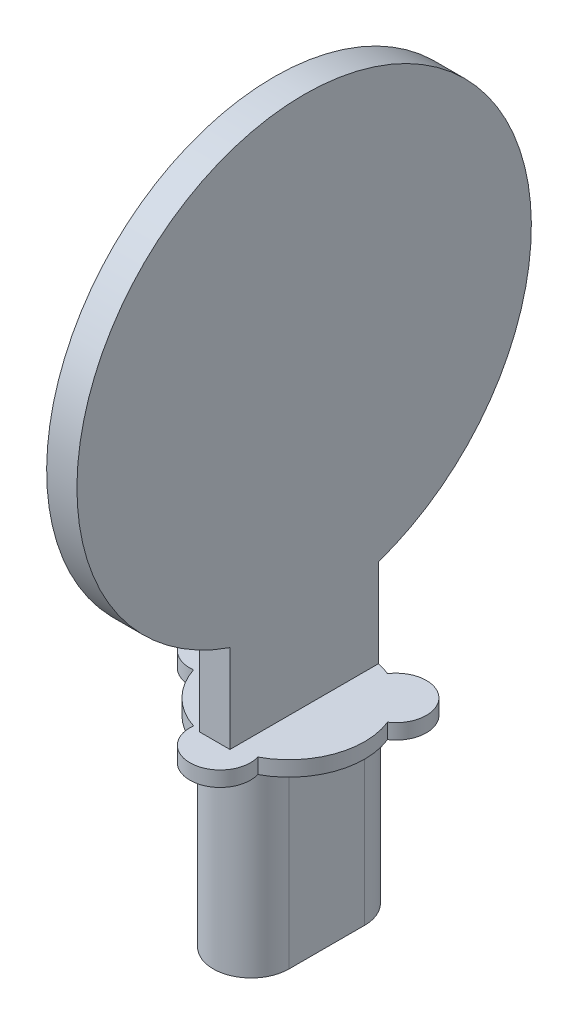
ISO-10303-21;
HEADER;
FILE_DESCRIPTION(('STEP AP214'),'2;1');
FILE_NAME('part.step','',(''),(''),'','','');
FILE_SCHEMA(('AUTOMOTIVE_DESIGN { 1 0 10303 214 1 1 1 1 }'));
ENDSEC;
DATA;
#1=APPLICATION_CONTEXT('core data for automotive mechanical design processes');
#2=APPLICATION_PROTOCOL_DEFINITION('international standard','automotive_design',2000,#1);
#3=PRODUCT_CONTEXT('',#1,'mechanical');
#4=PRODUCT('Part','Part','',(#3));
#5=PRODUCT_RELATED_PRODUCT_CATEGORY('part','',(#4));
#6=PRODUCT_DEFINITION_FORMATION('','',#4);
#7=PRODUCT_DEFINITION_CONTEXT('part definition',#1,'design');
#8=PRODUCT_DEFINITION('design','',#6,#7);
#9=PRODUCT_DEFINITION_SHAPE('','',#8);
#10=(LENGTH_UNIT() NAMED_UNIT(*) SI_UNIT(.MILLI.,.METRE.));
#11=(NAMED_UNIT(*) PLANE_ANGLE_UNIT() SI_UNIT($,.RADIAN.));
#12=(NAMED_UNIT(*) SI_UNIT($,.STERADIAN.) SOLID_ANGLE_UNIT());
#13=UNCERTAINTY_MEASURE_WITH_UNIT(LENGTH_MEASURE(1.E-05),#10,'distance_accuracy_value','');
#14=(GEOMETRIC_REPRESENTATION_CONTEXT(3) GLOBAL_UNCERTAINTY_ASSIGNED_CONTEXT((#13)) GLOBAL_UNIT_ASSIGNED_CONTEXT((#10,
#11,#12)) REPRESENTATION_CONTEXT('',''));
#15=CARTESIAN_POINT('',(0.,0.,0.));
#16=DIRECTION('',(0.,0.,1.));
#17=DIRECTION('',(1.,0.,0.));
#18=AXIS2_PLACEMENT_3D('',#15,#16,#17);
#19=CARTESIAN_POINT('',(0.,0.,-2.5));
#20=DIRECTION('',(0.,1.,0.));
#21=DIRECTION('',(0.,0.,1.));
#22=AXIS2_PLACEMENT_3D('',#19,#20,#21);
#23=PLANE('',#22);
#24=CARTESIAN_POINT('',(0.,0.,0.));
#25=DIRECTION('',(0.,1.,0.));
#26=DIRECTION('',(0.,0.,1.));
#27=AXIS2_PLACEMENT_3D('',#24,#25,#26);
#28=CIRCLE('',#27,5.);
#29=CARTESIAN_POINT('',(1.,0.,-4.89897948556636));
#30=VERTEX_POINT('',#29);
#31=CARTESIAN_POINT('',(-1.,0.,-4.89897948556636));
#32=VERTEX_POINT('',#31);
#33=EDGE_CURVE('E267',#30,#32,#28,.T.);
#34=ORIENTED_EDGE('',*,*,#33,.T.);
#35=DIRECTION('',(1.,0.,0.));
#36=VECTOR('',#35,1.);
#37=CARTESIAN_POINT('',(-0.999999999999999,0.,-4.89897948556636));
#38=LINE('',#37,#36);
#39=EDGE_CURVE('E197',#32,#30,#38,.T.);
#40=ORIENTED_EDGE('',*,*,#39,.T.);
#41=EDGE_LOOP('',(#34,#40));
#42=FACE_BOUND('',#41,.T.);
#43=ADVANCED_FACE('F68',(#42),#23,.T.);
#44=CARTESIAN_POINT('',(0.,-13.,-2.5));
#45=DIRECTION('',(0.,1.,0.));
#46=DIRECTION('',(0.,0.,1.));
#47=AXIS2_PLACEMENT_3D('',#44,#45,#46);
#48=CYLINDRICAL_SURFACE('',#47,2.5);
#49=CARTESIAN_POINT('',(0.,-0.999999999999999,-2.5));
#50=DIRECTION('',(0.,1.,0.));
#51=DIRECTION('',(0.,0.,1.));
#52=AXIS2_PLACEMENT_3D('',#49,#50,#51);
#53=CIRCLE('',#52,2.5);
#54=CARTESIAN_POINT('',(-2.5,-1.,-2.5));
#55=VERTEX_POINT('',#54);
#56=CARTESIAN_POINT('',(0.,-1.,-5.));
#57=VERTEX_POINT('',#56);
#58=EDGE_CURVE('E276',#55,#57,#53,.F.);
#59=ORIENTED_EDGE('',*,*,#58,.T.);
#60=CARTESIAN_POINT('',(2.5,-0.999999999999999,-2.5));
#61=VERTEX_POINT('',#60);
#62=EDGE_CURVE('E280',#57,#61,#53,.F.);
#63=ORIENTED_EDGE('',*,*,#62,.T.);
#64=DIRECTION('',(0.,1.,0.));
#65=VECTOR('',#64,1.);
#66=CARTESIAN_POINT('',(2.5,-13.,-2.5));
#67=LINE('',#66,#65);
#68=CARTESIAN_POINT('',(2.5,-13.,-2.5));
#69=VERTEX_POINT('',#68);
#70=EDGE_CURVE('E77',#69,#61,#67,.T.);
#71=ORIENTED_EDGE('',*,*,#70,.F.);
#72=CARTESIAN_POINT('',(0.,-13.,-2.5));
#73=DIRECTION('',(0.,1.,0.));
#74=DIRECTION('',(0.,0.,1.));
#75=AXIS2_PLACEMENT_3D('',#72,#73,#74);
#76=CIRCLE('',#75,2.5);
#77=CARTESIAN_POINT('',(-2.5,-13.,-2.5));
#78=VERTEX_POINT('',#77);
#79=EDGE_CURVE('E281',#69,#78,#76,.T.);
#80=ORIENTED_EDGE('',*,*,#79,.T.);
#81=DIRECTION('',(0.,1.,0.));
#82=VECTOR('',#81,1.);
#83=CARTESIAN_POINT('',(-2.5,-13.,-2.5));
#84=LINE('',#83,#82);
#85=EDGE_CURVE('E296',#78,#55,#84,.T.);
#86=ORIENTED_EDGE('',*,*,#85,.T.);
#87=EDGE_LOOP('',(#59,#63,#71,#80,#86));
#88=FACE_BOUND('',#87,.T.);
#89=ADVANCED_FACE('F70',(#88),#48,.T.);
#90=CARTESIAN_POINT('',(2.5,-13.,-2.5));
#91=DIRECTION('',(-1.,0.,0.));
#92=DIRECTION('',(0.,0.,1.));
#93=AXIS2_PLACEMENT_3D('',#90,#91,#92);
#94=PLANE('',#93);
#95=DIRECTION('',(0.,0.,-1.));
#96=VECTOR('',#95,1.);
#97=CARTESIAN_POINT('',(2.5,-0.999999999999999,-2.5));
#98=LINE('',#97,#96);
#99=CARTESIAN_POINT('',(2.50000000000001,-0.999999999999999,2.5));
#100=VERTEX_POINT('',#99);
#101=EDGE_CURVE('E273',#100,#61,#98,.T.);
#102=ORIENTED_EDGE('',*,*,#101,.F.);
#103=DIRECTION('',(0.,1.,0.));
#104=VECTOR('',#103,1.);
#105=CARTESIAN_POINT('',(2.50000000000001,-13.,2.5));
#106=LINE('',#105,#104);
#107=CARTESIAN_POINT('',(2.50000000000001,-13.,2.5));
#108=VERTEX_POINT('',#107);
#109=EDGE_CURVE('E300',#108,#100,#106,.T.);
#110=ORIENTED_EDGE('',*,*,#109,.F.);
#111=DIRECTION('',(0.,0.,1.));
#112=VECTOR('',#111,1.);
#113=CARTESIAN_POINT('',(2.5,-13.,-2.5));
#114=LINE('',#113,#112);
#115=EDGE_CURVE('E293',#69,#108,#114,.T.);
#116=ORIENTED_EDGE('',*,*,#115,.F.);
#117=ORIENTED_EDGE('',*,*,#70,.T.);
#118=EDGE_LOOP('',(#102,#110,#116,#117));
#119=FACE_BOUND('',#118,.T.);
#120=ADVANCED_FACE('F326',(#119),#94,.F.);
#121=CARTESIAN_POINT('',(0.,-13.,2.5));
#122=DIRECTION('',(0.,1.,0.));
#123=DIRECTION('',(0.,0.,1.));
#124=AXIS2_PLACEMENT_3D('',#121,#122,#123);
#125=CYLINDRICAL_SURFACE('',#124,2.5);
#126=ORIENTED_EDGE('',*,*,#109,.T.);
#127=CARTESIAN_POINT('',(0.,-0.999999999999999,2.5));
#128=DIRECTION('',(0.,1.,0.));
#129=DIRECTION('',(0.,0.,1.));
#130=AXIS2_PLACEMENT_3D('',#127,#128,#129);
#131=CIRCLE('',#130,2.5);
#132=CARTESIAN_POINT('',(-2.5,-0.999999999999999,2.5));
#133=VERTEX_POINT('',#132);
#134=EDGE_CURVE('E224',#100,#133,#131,.F.);
#135=ORIENTED_EDGE('',*,*,#134,.T.);
#136=DIRECTION('',(0.,1.,0.));
#137=VECTOR('',#136,1.);
#138=CARTESIAN_POINT('',(-2.5,-13.,2.5));
#139=LINE('',#138,#137);
#140=CARTESIAN_POINT('',(-2.5,-13.,2.5));
#141=VERTEX_POINT('',#140);
#142=EDGE_CURVE('E304',#141,#133,#139,.T.);
#143=ORIENTED_EDGE('',*,*,#142,.F.);
#144=CARTESIAN_POINT('',(0.,-13.,2.5));
#145=DIRECTION('',(0.,1.,0.));
#146=DIRECTION('',(0.,0.,1.));
#147=AXIS2_PLACEMENT_3D('',#144,#145,#146);
#148=CIRCLE('',#147,2.5);
#149=EDGE_CURVE('E289',#141,#108,#148,.T.);
#150=ORIENTED_EDGE('',*,*,#149,.T.);
#151=EDGE_LOOP('',(#126,#135,#143,#150));
#152=FACE_BOUND('',#151,.T.);
#153=ADVANCED_FACE('F321',(#152),#125,.T.);
#154=CARTESIAN_POINT('',(-2.5,-13.,-2.5));
#155=DIRECTION('',(-1.,0.,0.));
#156=DIRECTION('',(0.,0.,1.));
#157=AXIS2_PLACEMENT_3D('',#154,#155,#156);
#158=PLANE('',#157);
#159=ORIENTED_EDGE('',*,*,#142,.T.);
#160=DIRECTION('',(0.,0.,-1.));
#161=VECTOR('',#160,1.);
#162=CARTESIAN_POINT('',(-2.5,-0.999999999999999,-2.5));
#163=LINE('',#162,#161);
#164=EDGE_CURVE('E12',#133,#55,#163,.T.);
#165=ORIENTED_EDGE('',*,*,#164,.T.);
#166=ORIENTED_EDGE('',*,*,#85,.F.);
#167=DIRECTION('',(0.,0.,1.));
#168=VECTOR('',#167,1.);
#169=CARTESIAN_POINT('',(-2.5,-13.,-2.5));
#170=LINE('',#169,#168);
#171=EDGE_CURVE('E285',#78,#141,#170,.T.);
#172=ORIENTED_EDGE('',*,*,#171,.T.);
#173=EDGE_LOOP('',(#159,#165,#166,#172));
#174=FACE_BOUND('',#173,.T.);
#175=ADVANCED_FACE('F314',(#174),#158,.T.);
#176=CARTESIAN_POINT('',(0.,-13.,-2.5));
#177=DIRECTION('',(0.,1.,0.));
#178=DIRECTION('',(0.,0.,1.));
#179=AXIS2_PLACEMENT_3D('',#176,#177,#178);
#180=PLANE('',#179);
#181=ORIENTED_EDGE('',*,*,#79,.F.);
#182=ORIENTED_EDGE('',*,*,#115,.T.);
#183=ORIENTED_EDGE('',*,*,#149,.F.);
#184=ORIENTED_EDGE('',*,*,#171,.F.);
#185=EDGE_LOOP('',(#181,#182,#183,#184));
#186=FACE_BOUND('',#185,.T.);
#187=ADVANCED_FACE('F317',(#186),#180,.F.);
#188=CARTESIAN_POINT('',(0.,-1.,0.));
#189=DIRECTION('',(0.,1.,0.));
#190=DIRECTION('',(0.,0.,1.));
#191=AXIS2_PLACEMENT_3D('',#188,#189,#190);
#192=CYLINDRICAL_SURFACE('',#191,5.);
#193=DIRECTION('',(0.,1.,0.));
#194=VECTOR('',#193,1.);
#195=CARTESIAN_POINT('',(-4.41170593291399,-1.,-2.35305137247182));
#196=LINE('',#195,#194);
#197=CARTESIAN_POINT('',(-4.41170593291399,-1.,-2.35305137247182));
#198=VERTEX_POINT('',#197);
#199=CARTESIAN_POINT('',(-4.41170593291399,0.,-2.35305137247182));
#200=VERTEX_POINT('',#199);
#201=EDGE_CURVE('E231',#198,#200,#196,.T.);
#202=ORIENTED_EDGE('',*,*,#201,.T.);
#203=EDGE_CURVE('E268',#32,#200,#28,.T.);
#204=ORIENTED_EDGE('',*,*,#203,.F.);
#205=ORIENTED_EDGE('',*,*,#33,.F.);
#206=CARTESIAN_POINT('',(1.86705054740302,0.,-4.63833183951322));
#207=VERTEX_POINT('',#206);
#208=EDGE_CURVE('E262',#207,#30,#28,.T.);
#209=ORIENTED_EDGE('',*,*,#208,.F.);
#210=DIRECTION('',(0.,1.,0.));
#211=VECTOR('',#210,1.);
#212=CARTESIAN_POINT('',(1.86705054740302,-1.,-4.63833183951322));
#213=LINE('',#212,#211);
#214=CARTESIAN_POINT('',(1.86705054740302,-1.,-4.63833183951322));
#215=VERTEX_POINT('',#214);
#216=EDGE_CURVE('E236',#215,#207,#213,.T.);
#217=ORIENTED_EDGE('',*,*,#216,.F.);
#218=CARTESIAN_POINT('',(0.,-1.,0.));
#219=DIRECTION('',(0.,1.,0.));
#220=DIRECTION('',(0.,0.,1.));
#221=AXIS2_PLACEMENT_3D('',#218,#219,#220);
#222=CIRCLE('',#221,5.);
#223=EDGE_CURVE('E251',#215,#57,#222,.T.);
#224=ORIENTED_EDGE('',*,*,#223,.T.);
#225=EDGE_CURVE('E260',#57,#198,#222,.T.);
#226=ORIENTED_EDGE('',*,*,#225,.T.);
#227=EDGE_LOOP('',(#202,#204,#205,#209,#217,#224,#226));
#228=FACE_BOUND('',#227,.T.);
#229=ADVANCED_FACE('F355',(#228),#192,.T.);
#230=CARTESIAN_POINT('',(0.435778713738293,-1.,4.98097349045873));
#231=DIRECTION('',(0.,1.,0.));
#232=DIRECTION('',(0.,0.,1.));
#233=AXIS2_PLACEMENT_3D('',#230,#231,#232);
#234=CYLINDRICAL_SURFACE('',#233,2.);
#235=CARTESIAN_POINT('',(0.435778713738293,0.,4.98097349045873));
#236=DIRECTION('',(0.,1.,0.));
#237=DIRECTION('',(0.,0.,1.));
#238=AXIS2_PLACEMENT_3D('',#235,#236,#237);
#239=CIRCLE('',#238,2.);
#240=CARTESIAN_POINT('',(-1.55121853919334,0.,4.75328528953006));
#241=VERTEX_POINT('',#240);
#242=CARTESIAN_POINT('',(2.3530513724718,0.,4.411705932914));
#243=VERTEX_POINT('',#242);
#244=EDGE_CURVE('E216',#241,#243,#239,.T.);
#245=ORIENTED_EDGE('',*,*,#244,.F.);
#246=DIRECTION('',(0.,1.,0.));
#247=VECTOR('',#246,1.);
#248=CARTESIAN_POINT('',(-1.55121853919334,-1.,4.75328528953006));
#249=LINE('',#248,#247);
#250=CARTESIAN_POINT('',(-1.55121853919334,-1.,4.75328528953006));
#251=VERTEX_POINT('',#250);
#252=EDGE_CURVE('E215',#251,#241,#249,.T.);
#253=ORIENTED_EDGE('',*,*,#252,.F.);
#254=CARTESIAN_POINT('',(0.435778713738293,-1.,4.98097349045873));
#255=DIRECTION('',(0.,1.,0.));
#256=DIRECTION('',(0.,0.,1.));
#257=AXIS2_PLACEMENT_3D('',#254,#255,#256);
#258=CIRCLE('',#257,2.);
#259=CARTESIAN_POINT('',(2.3530513724718,-1.,4.411705932914));
#260=VERTEX_POINT('',#259);
#261=EDGE_CURVE('E211',#251,#260,#258,.T.);
#262=ORIENTED_EDGE('',*,*,#261,.T.);
#263=DIRECTION('',(0.,1.,0.));
#264=VECTOR('',#263,1.);
#265=CARTESIAN_POINT('',(2.3530513724718,-1.,4.411705932914));
#266=LINE('',#265,#264);
#267=EDGE_CURVE('E221',#260,#243,#266,.T.);
#268=ORIENTED_EDGE('',*,*,#267,.T.);
#269=EDGE_LOOP('',(#245,#253,#262,#268));
#270=FACE_BOUND('',#269,.T.);
#271=ADVANCED_FACE('F391',(#270),#234,.T.);
#272=CARTESIAN_POINT('',(0.,-1.,0.));
#273=DIRECTION('',(0.,1.,0.));
#274=DIRECTION('',(0.,0.,1.));
#275=AXIS2_PLACEMENT_3D('',#272,#273,#274);
#276=PLANE('',#275);
#277=ORIENTED_EDGE('',*,*,#62,.F.);
#278=ORIENTED_EDGE('',*,*,#223,.F.);
#279=CARTESIAN_POINT('',(3.53553390593274,-1.,-3.53553390593274));
#280=DIRECTION('',(0.,1.,0.));
#281=DIRECTION('',(0.,0.,1.));
#282=AXIS2_PLACEMENT_3D('',#279,#280,#281);
#283=CIRCLE('',#282,2.);
#284=CARTESIAN_POINT('',(4.63833183951322,-1.,-1.86705054740301));
#285=VERTEX_POINT('',#284);
#286=EDGE_CURVE('E242',#285,#215,#283,.T.);
#287=ORIENTED_EDGE('',*,*,#286,.F.);
#288=EDGE_CURVE('E266',#260,#285,#222,.T.);
#289=ORIENTED_EDGE('',*,*,#288,.F.);
#290=ORIENTED_EDGE('',*,*,#261,.F.);
#291=CARTESIAN_POINT('',(-4.75328528953006,-1.,1.55121853919333));
#292=VERTEX_POINT('',#291);
#293=EDGE_CURVE('E261',#292,#251,#222,.T.);
#294=ORIENTED_EDGE('',*,*,#293,.F.);
#295=CARTESIAN_POINT('',(-4.98097349045873,-1.,-0.435778713738309));
#296=DIRECTION('',(0.,1.,0.));
#297=DIRECTION('',(0.,0.,1.));
#298=AXIS2_PLACEMENT_3D('',#295,#296,#297);
#299=CIRCLE('',#298,2.);
#300=EDGE_CURVE('E227',#198,#292,#299,.T.);
#301=ORIENTED_EDGE('',*,*,#300,.F.);
#302=ORIENTED_EDGE('',*,*,#225,.F.);
#303=ORIENTED_EDGE('',*,*,#58,.F.);
#304=ORIENTED_EDGE('',*,*,#164,.F.);
#305=ORIENTED_EDGE('',*,*,#134,.F.);
#306=ORIENTED_EDGE('',*,*,#101,.T.);
#307=EDGE_LOOP('',(#277,#278,#287,#289,#290,#294,#301,#302,#303,#304,#305,#306));
#308=FACE_BOUND('',#307,.T.);
#309=ADVANCED_FACE('F324',(#308),#276,.F.);
#310=CARTESIAN_POINT('',(-4.98097349045873,-1.,-0.435778713738309));
#311=DIRECTION('',(0.,1.,0.));
#312=DIRECTION('',(0.,0.,1.));
#313=AXIS2_PLACEMENT_3D('',#310,#311,#312);
#314=CYLINDRICAL_SURFACE('',#313,2.);
#315=CARTESIAN_POINT('',(-4.98097349045873,0.,-0.435778713738309));
#316=DIRECTION('',(0.,1.,0.));
#317=DIRECTION('',(0.,0.,1.));
#318=AXIS2_PLACEMENT_3D('',#315,#316,#317);
#319=CIRCLE('',#318,2.);
#320=CARTESIAN_POINT('',(-4.75328528953006,0.,1.55121853919333));
#321=VERTEX_POINT('',#320);
#322=EDGE_CURVE('E232',#200,#321,#319,.T.);
#323=ORIENTED_EDGE('',*,*,#322,.F.);
#324=ORIENTED_EDGE('',*,*,#201,.F.);
#325=ORIENTED_EDGE('',*,*,#300,.T.);
#326=DIRECTION('',(0.,1.,0.));
#327=VECTOR('',#326,1.);
#328=CARTESIAN_POINT('',(-4.75328528953006,-1.,1.55121853919333));
#329=LINE('',#328,#327);
#330=EDGE_CURVE('E220',#292,#321,#329,.T.);
#331=ORIENTED_EDGE('',*,*,#330,.T.);
#332=EDGE_LOOP('',(#323,#324,#325,#331));
#333=FACE_BOUND('',#332,.T.);
#334=ADVANCED_FACE('F390',(#333),#314,.T.);
#335=CARTESIAN_POINT('',(3.53553390593274,-1.,-3.53553390593274));
#336=DIRECTION('',(0.,1.,0.));
#337=DIRECTION('',(0.,0.,1.));
#338=AXIS2_PLACEMENT_3D('',#335,#336,#337);
#339=CYLINDRICAL_SURFACE('',#338,2.);
#340=CARTESIAN_POINT('',(3.53553390593274,0.,-3.53553390593274));
#341=DIRECTION('',(0.,1.,0.));
#342=DIRECTION('',(0.,0.,1.));
#343=AXIS2_PLACEMENT_3D('',#340,#341,#342);
#344=CIRCLE('',#343,2.);
#345=CARTESIAN_POINT('',(4.63833183951322,0.,-1.86705054740301));
#346=VERTEX_POINT('',#345);
#347=EDGE_CURVE('E247',#346,#207,#344,.T.);
#348=ORIENTED_EDGE('',*,*,#347,.F.);
#349=DIRECTION('',(0.,1.,0.));
#350=VECTOR('',#349,1.);
#351=CARTESIAN_POINT('',(4.63833183951322,-1.,-1.86705054740301));
#352=LINE('',#351,#350);
#353=EDGE_CURVE('E246',#285,#346,#352,.T.);
#354=ORIENTED_EDGE('',*,*,#353,.F.);
#355=ORIENTED_EDGE('',*,*,#286,.T.);
#356=ORIENTED_EDGE('',*,*,#216,.T.);
#357=EDGE_LOOP('',(#348,#354,#355,#356));
#358=FACE_BOUND('',#357,.T.);
#359=ADVANCED_FACE('F351',(#358),#339,.T.);
#360=EDGE_CURVE('E210',#243,#346,#28,.T.);
#361=ORIENTED_EDGE('',*,*,#360,.F.);
#362=ORIENTED_EDGE('',*,*,#267,.F.);
#363=ORIENTED_EDGE('',*,*,#288,.T.);
#364=ORIENTED_EDGE('',*,*,#353,.T.);
#365=EDGE_LOOP('',(#361,#362,#363,#364));
#366=FACE_BOUND('',#365,.T.);
#367=ADVANCED_FACE('F347',(#366),#192,.T.);
#368=ORIENTED_EDGE('',*,*,#293,.T.);
#369=ORIENTED_EDGE('',*,*,#252,.T.);
#370=EDGE_CURVE('E269',#321,#241,#28,.T.);
#371=ORIENTED_EDGE('',*,*,#370,.F.);
#372=ORIENTED_EDGE('',*,*,#330,.F.);
#373=EDGE_LOOP('',(#368,#369,#371,#372));
#374=FACE_BOUND('',#373,.T.);
#375=ADVANCED_FACE('F380',(#374),#192,.T.);
#376=DIRECTION('',(1.,0.,0.));
#377=VECTOR('',#376,1.);
#378=CARTESIAN_POINT('',(-0.999999999999999,0.,4.89897948556636));
#379=LINE('',#378,#377);
#380=CARTESIAN_POINT('',(-0.999999999999999,0.,4.89897948556636));
#381=VERTEX_POINT('',#380);
#382=CARTESIAN_POINT('',(1.,0.,4.89897948556636));
#383=VERTEX_POINT('',#382);
#384=EDGE_CURVE('E358',#381,#383,#379,.T.);
#385=ORIENTED_EDGE('',*,*,#384,.F.);
#386=DIRECTION('',(0.,0.,-1.));
#387=VECTOR('',#386,1.);
#388=CARTESIAN_POINT('',(-0.999999999999999,0.,4.89897948556636));
#389=LINE('',#388,#387);
#390=EDGE_CURVE('E204',#381,#32,#389,.T.);
#391=ORIENTED_EDGE('',*,*,#390,.T.);
#392=ORIENTED_EDGE('',*,*,#203,.T.);
#393=ORIENTED_EDGE('',*,*,#322,.T.);
#394=ORIENTED_EDGE('',*,*,#370,.T.);
#395=ORIENTED_EDGE('',*,*,#244,.T.);
#396=ORIENTED_EDGE('',*,*,#360,.T.);
#397=ORIENTED_EDGE('',*,*,#347,.T.);
#398=ORIENTED_EDGE('',*,*,#208,.T.);
#399=DIRECTION('',(0.,0.,-1.));
#400=VECTOR('',#399,1.);
#401=CARTESIAN_POINT('',(1.,0.,4.89897948556636));
#402=LINE('',#401,#400);
#403=EDGE_CURVE('E357',#383,#30,#402,.T.);
#404=ORIENTED_EDGE('',*,*,#403,.F.);
#405=EDGE_LOOP('',(#385,#391,#392,#393,#394,#395,#396,#397,#398,#404));
#406=FACE_BOUND('',#405,.T.);
#407=ADVANCED_FACE('F342',(#406),#23,.T.);
#408=CARTESIAN_POINT('',(-0.999999999999999,20.,4.89897948556636));
#409=DIRECTION('',(0.,0.,-1.));
#410=DIRECTION('',(-1.,0.,0.));
#411=AXIS2_PLACEMENT_3D('',#408,#409,#410);
#412=PLANE('',#411);
#413=DIRECTION('',(0.,-1.,0.));
#414=VECTOR('',#413,1.);
#415=CARTESIAN_POINT('',(1.,20.,4.89897948556636));
#416=LINE('',#415,#414);
#417=CARTESIAN_POINT('',(1.,5.82255312124217,4.89897948556636));
#418=VERTEX_POINT('',#417);
#419=EDGE_CURVE('E92',#418,#383,#416,.T.);
#420=ORIENTED_EDGE('',*,*,#419,.F.);
#421=DIRECTION('',(-1.,0.,0.));
#422=VECTOR('',#421,1.);
#423=CARTESIAN_POINT('',(1.,5.82255312124217,4.89897948556636));
#424=LINE('',#423,#422);
#425=CARTESIAN_POINT('',(-0.999999999999999,5.82255312124217,4.89897948556636));
#426=VERTEX_POINT('',#425);
#427=EDGE_CURVE('E185',#418,#426,#424,.T.);
#428=ORIENTED_EDGE('',*,*,#427,.T.);
#429=DIRECTION('',(0.,-1.,0.));
#430=VECTOR('',#429,1.);
#431=CARTESIAN_POINT('',(-0.999999999999999,20.,4.89897948556636));
#432=LINE('',#431,#430);
#433=EDGE_CURVE('E84',#426,#381,#432,.T.);
#434=ORIENTED_EDGE('',*,*,#433,.T.);
#435=ORIENTED_EDGE('',*,*,#384,.T.);
#436=EDGE_LOOP('',(#420,#428,#434,#435));
#437=FACE_BOUND('',#436,.T.);
#438=ADVANCED_FACE('F361',(#437),#412,.F.);
#439=CARTESIAN_POINT('',(1.,20.,4.89897948556636));
#440=DIRECTION('',(-1.,0.,0.));
#441=DIRECTION('',(0.,0.,1.));
#442=AXIS2_PLACEMENT_3D('',#439,#440,#441);
#443=PLANE('',#442);
#444=CARTESIAN_POINT('',(1.,20.,0.));
#445=DIRECTION('',(-1.,0.,0.));
#446=DIRECTION('',(0.,0.,1.));
#447=AXIS2_PLACEMENT_3D('',#444,#445,#446);
#448=CIRCLE('',#447,15.);
#449=CARTESIAN_POINT('',(1.,5.82255312124217,-4.89897948556636));
#450=VERTEX_POINT('',#449);
#451=EDGE_CURVE('E180',#418,#450,#448,.T.);
#452=ORIENTED_EDGE('',*,*,#451,.F.);
#453=ORIENTED_EDGE('',*,*,#419,.T.);
#454=ORIENTED_EDGE('',*,*,#403,.T.);
#455=DIRECTION('',(0.,-1.,0.));
#456=VECTOR('',#455,1.);
#457=CARTESIAN_POINT('',(1.,20.,-4.89897948556636));
#458=LINE('',#457,#456);
#459=EDGE_CURVE('E199',#450,#30,#458,.T.);
#460=ORIENTED_EDGE('',*,*,#459,.F.);
#461=EDGE_LOOP('',(#452,#453,#454,#460));
#462=FACE_BOUND('',#461,.T.);
#463=ADVANCED_FACE('F385',(#462),#443,.F.);
#464=CARTESIAN_POINT('',(-0.999999999999999,20.,-4.89897948556636));
#465=DIRECTION('',(0.,0.,-1.));
#466=DIRECTION('',(-1.,0.,0.));
#467=AXIS2_PLACEMENT_3D('',#464,#465,#466);
#468=PLANE('',#467);
#469=DIRECTION('',(-1.,0.,0.));
#470=VECTOR('',#469,1.);
#471=CARTESIAN_POINT('',(1.,5.82255312124217,-4.89897948556636));
#472=LINE('',#471,#470);
#473=CARTESIAN_POINT('',(-0.999999999999999,5.82255312124217,-4.89897948556636));
#474=VERTEX_POINT('',#473);
#475=EDGE_CURVE('E176',#450,#474,#472,.T.);
#476=ORIENTED_EDGE('',*,*,#475,.F.);
#477=ORIENTED_EDGE('',*,*,#459,.T.);
#478=ORIENTED_EDGE('',*,*,#39,.F.);
#479=DIRECTION('',(0.,-1.,0.));
#480=VECTOR('',#479,1.);
#481=CARTESIAN_POINT('',(-0.999999999999999,20.,-4.89897948556636));
#482=LINE('',#481,#480);
#483=EDGE_CURVE('E190',#474,#32,#482,.T.);
#484=ORIENTED_EDGE('',*,*,#483,.F.);
#485=EDGE_LOOP('',(#476,#477,#478,#484));
#486=FACE_BOUND('',#485,.T.);
#487=ADVANCED_FACE('F195',(#486),#468,.T.);
#488=CARTESIAN_POINT('',(-0.999999999999999,20.,4.89897948556636));
#489=DIRECTION('',(-1.,0.,0.));
#490=DIRECTION('',(0.,0.,1.));
#491=AXIS2_PLACEMENT_3D('',#488,#489,#490);
#492=PLANE('',#491);
#493=ORIENTED_EDGE('',*,*,#433,.F.);
#494=CARTESIAN_POINT('',(-0.999999999999999,20.,0.));
#495=DIRECTION('',(-1.,0.,0.));
#496=DIRECTION('',(0.,0.,1.));
#497=AXIS2_PLACEMENT_3D('',#494,#495,#496);
#498=CIRCLE('',#497,15.);
#499=EDGE_CURVE('E179',#426,#474,#498,.T.);
#500=ORIENTED_EDGE('',*,*,#499,.T.);
#501=ORIENTED_EDGE('',*,*,#483,.T.);
#502=ORIENTED_EDGE('',*,*,#390,.F.);
#503=EDGE_LOOP('',(#493,#500,#501,#502));
#504=FACE_BOUND('',#503,.T.);
#505=ADVANCED_FACE('F188',(#504),#492,.T.);
#506=CARTESIAN_POINT('',(1.,20.,0.));
#507=DIRECTION('',(-1.,0.,0.));
#508=DIRECTION('',(0.,0.,1.));
#509=AXIS2_PLACEMENT_3D('',#506,#507,#508);
#510=CYLINDRICAL_SURFACE('',#509,15.);
#511=ORIENTED_EDGE('',*,*,#427,.F.);
#512=ORIENTED_EDGE('',*,*,#451,.T.);
#513=ORIENTED_EDGE('',*,*,#475,.T.);
#514=ORIENTED_EDGE('',*,*,#499,.F.);
#515=EDGE_LOOP('',(#511,#512,#513,#514));
#516=FACE_BOUND('',#515,.T.);
#517=ADVANCED_FACE('F178',(#516),#510,.T.);
#518=CLOSED_SHELL('',(#43,#89,#120,#153,#175,#187,#229,#271,#309,#334,#359,#367,#375,#407,#438,
#463,#487,#505,#517));
#519=MANIFOLD_SOLID_BREP('B2',#518);
#520=ADVANCED_BREP_SHAPE_REPRESENTATION('',(#18,#519),#14);
#521=SHAPE_DEFINITION_REPRESENTATION(#9,#520);
ENDSEC;
END-ISO-10303-21;
